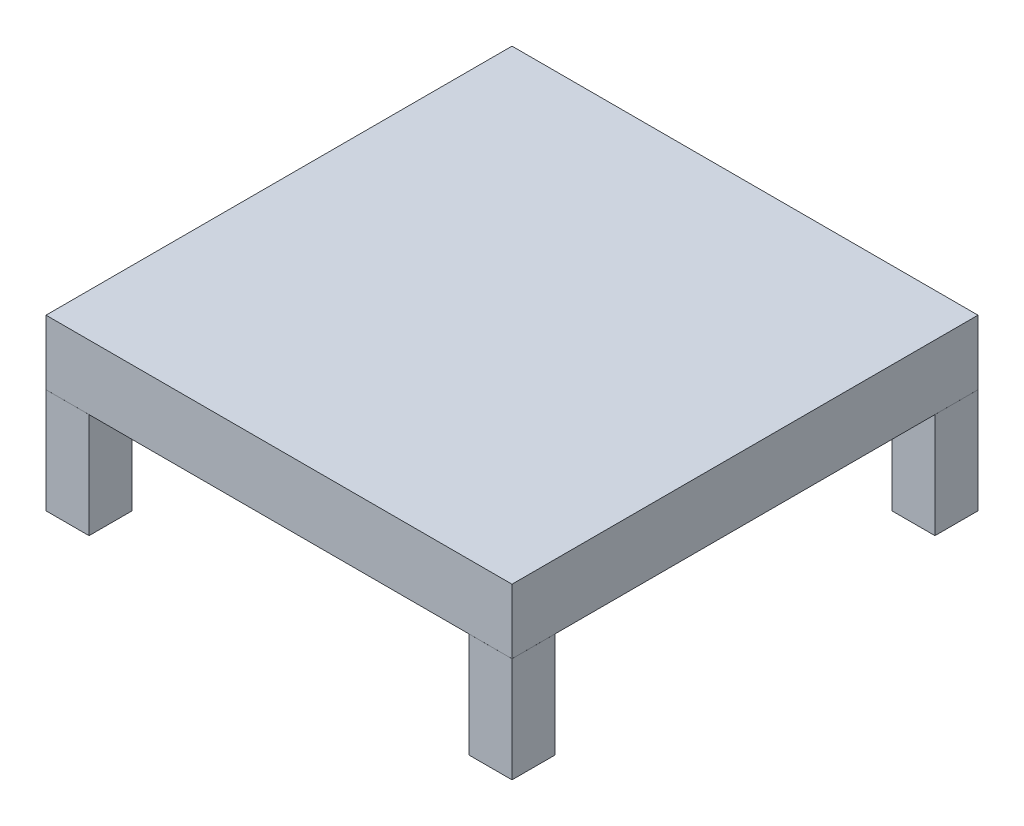
ISO-10303-21;
HEADER;
FILE_DESCRIPTION(('STEP AP214'),'2;1');
FILE_NAME('part.step','',(''),(''),'','','');
FILE_SCHEMA(('AUTOMOTIVE_DESIGN { 1 0 10303 214 1 1 1 1 }'));
ENDSEC;
DATA;
#1=APPLICATION_CONTEXT('core data for automotive mechanical design processes');
#2=APPLICATION_PROTOCOL_DEFINITION('international standard','automotive_design',2000,#1);
#3=PRODUCT_CONTEXT('',#1,'mechanical');
#4=PRODUCT('Part','Part','',(#3));
#5=PRODUCT_RELATED_PRODUCT_CATEGORY('part','',(#4));
#6=PRODUCT_DEFINITION_FORMATION('','',#4);
#7=PRODUCT_DEFINITION_CONTEXT('part definition',#1,'design');
#8=PRODUCT_DEFINITION('design','',#6,#7);
#9=PRODUCT_DEFINITION_SHAPE('','',#8);
#10=(LENGTH_UNIT() NAMED_UNIT(*) SI_UNIT(.MILLI.,.METRE.));
#11=(NAMED_UNIT(*) PLANE_ANGLE_UNIT() SI_UNIT($,.RADIAN.));
#12=(NAMED_UNIT(*) SI_UNIT($,.STERADIAN.) SOLID_ANGLE_UNIT());
#13=UNCERTAINTY_MEASURE_WITH_UNIT(LENGTH_MEASURE(1.E-05),#10,'distance_accuracy_value','');
#14=(GEOMETRIC_REPRESENTATION_CONTEXT(3) GLOBAL_UNCERTAINTY_ASSIGNED_CONTEXT((#13)) GLOBAL_UNIT_ASSIGNED_CONTEXT((#10,
#11,#12)) REPRESENTATION_CONTEXT('',''));
#15=CARTESIAN_POINT('',(0.,0.,0.));
#16=DIRECTION('',(0.,0.,1.));
#17=DIRECTION('',(1.,0.,0.));
#18=AXIS2_PLACEMENT_3D('',#15,#16,#17);
#19=CARTESIAN_POINT('',(-275.,38.1,-275.));
#20=DIRECTION('',(1.,0.,0.));
#21=DIRECTION('',(0.,0.,-1.));
#22=AXIS2_PLACEMENT_3D('',#19,#20,#21);
#23=PLANE('',#22);
#24=DIRECTION('',(0.,-1.,0.));
#25=VECTOR('',#24,1.);
#26=CARTESIAN_POINT('',(-275.,38.1,-275.));
#27=LINE('',#26,#25);
#28=CARTESIAN_POINT('',(-275.,38.1,-275.));
#29=VERTEX_POINT('',#28);
#30=CARTESIAN_POINT('',(-275.,-38.1,-275.));
#31=VERTEX_POINT('',#30);
#32=EDGE_CURVE('E111',#29,#31,#27,.T.);
#33=ORIENTED_EDGE('',*,*,#32,.T.);
#34=DIRECTION('',(0.,0.,1.));
#35=VECTOR('',#34,1.);
#36=CARTESIAN_POINT('',(-275.,-38.1,295.148496587345));
#37=LINE('',#36,#35);
#38=CARTESIAN_POINT('',(-275.,-38.1,275.));
#39=VERTEX_POINT('',#38);
#40=EDGE_CURVE('E86',#31,#39,#37,.T.);
#41=ORIENTED_EDGE('',*,*,#40,.T.);
#42=DIRECTION('',(0.,-1.,0.));
#43=VECTOR('',#42,1.);
#44=CARTESIAN_POINT('',(-275.,38.1,275.));
#45=LINE('',#44,#43);
#46=CARTESIAN_POINT('',(-275.,38.1,275.));
#47=VERTEX_POINT('',#46);
#48=EDGE_CURVE('E57',#47,#39,#45,.T.);
#49=ORIENTED_EDGE('',*,*,#48,.F.);
#50=DIRECTION('',(0.,0.,1.));
#51=VECTOR('',#50,1.);
#52=CARTESIAN_POINT('',(-275.,38.1,-275.));
#53=LINE('',#52,#51);
#54=EDGE_CURVE('E104',#29,#47,#53,.T.);
#55=ORIENTED_EDGE('',*,*,#54,.F.);
#56=EDGE_LOOP('',(#33,#41,#49,#55));
#57=FACE_BOUND('',#56,.T.);
#58=ADVANCED_FACE('F54',(#57),#23,.F.);
#59=CARTESIAN_POINT('',(-275.,38.1,275.));
#60=DIRECTION('',(0.,0.,-1.));
#61=DIRECTION('',(-1.,0.,0.));
#62=AXIS2_PLACEMENT_3D('',#59,#60,#61);
#63=PLANE('',#62);
#64=ORIENTED_EDGE('',*,*,#48,.T.);
#65=DIRECTION('',(1.,0.,0.));
#66=VECTOR('',#65,1.);
#67=CARTESIAN_POINT('',(-275.,-38.1,275.));
#68=LINE('',#67,#66);
#69=CARTESIAN_POINT('',(275.,-38.1,275.));
#70=VERTEX_POINT('',#69);
#71=EDGE_CURVE('E72',#39,#70,#68,.T.);
#72=ORIENTED_EDGE('',*,*,#71,.T.);
#73=DIRECTION('',(0.,-1.,0.));
#74=VECTOR('',#73,1.);
#75=CARTESIAN_POINT('',(275.,38.1,275.));
#76=LINE('',#75,#74);
#77=CARTESIAN_POINT('',(275.,38.1,275.));
#78=VERTEX_POINT('',#77);
#79=EDGE_CURVE('E102',#78,#70,#76,.T.);
#80=ORIENTED_EDGE('',*,*,#79,.F.);
#81=DIRECTION('',(1.,0.,0.));
#82=VECTOR('',#81,1.);
#83=CARTESIAN_POINT('',(-275.,38.1,275.));
#84=LINE('',#83,#82);
#85=EDGE_CURVE('E99',#47,#78,#84,.T.);
#86=ORIENTED_EDGE('',*,*,#85,.F.);
#87=EDGE_LOOP('',(#64,#72,#80,#86));
#88=FACE_BOUND('',#87,.T.);
#89=ADVANCED_FACE('F100',(#88),#63,.F.);
#90=CARTESIAN_POINT('',(275.,38.1,-275.));
#91=DIRECTION('',(-1.,0.,0.));
#92=DIRECTION('',(0.,0.,1.));
#93=AXIS2_PLACEMENT_3D('',#90,#91,#92);
#94=PLANE('',#93);
#95=ORIENTED_EDGE('',*,*,#79,.T.);
#96=DIRECTION('',(0.,0.,-1.));
#97=VECTOR('',#96,1.);
#98=CARTESIAN_POINT('',(275.,-38.1,-275.));
#99=LINE('',#98,#97);
#100=CARTESIAN_POINT('',(275.,-38.1,-275.));
#101=VERTEX_POINT('',#100);
#102=EDGE_CURVE('E117',#70,#101,#99,.T.);
#103=ORIENTED_EDGE('',*,*,#102,.T.);
#104=DIRECTION('',(0.,-1.,0.));
#105=VECTOR('',#104,1.);
#106=CARTESIAN_POINT('',(275.,38.1,-275.));
#107=LINE('',#106,#105);
#108=CARTESIAN_POINT('',(275.,38.1,-275.));
#109=VERTEX_POINT('',#108);
#110=EDGE_CURVE('E118',#109,#101,#107,.T.);
#111=ORIENTED_EDGE('',*,*,#110,.F.);
#112=DIRECTION('',(0.,0.,-1.));
#113=VECTOR('',#112,1.);
#114=CARTESIAN_POINT('',(275.,38.1,-275.));
#115=LINE('',#114,#113);
#116=EDGE_CURVE('E63',#78,#109,#115,.T.);
#117=ORIENTED_EDGE('',*,*,#116,.F.);
#118=EDGE_LOOP('',(#95,#103,#111,#117));
#119=FACE_BOUND('',#118,.T.);
#120=ADVANCED_FACE('F156',(#119),#94,.F.);
#121=CARTESIAN_POINT('',(-275.,38.1,-275.));
#122=DIRECTION('',(0.,0.,1.));
#123=DIRECTION('',(1.,0.,0.));
#124=AXIS2_PLACEMENT_3D('',#121,#122,#123);
#125=PLANE('',#124);
#126=ORIENTED_EDGE('',*,*,#110,.T.);
#127=DIRECTION('',(-1.,0.,0.));
#128=VECTOR('',#127,1.);
#129=CARTESIAN_POINT('',(-275.,-38.1,-275.));
#130=LINE('',#129,#128);
#131=EDGE_CURVE('E108',#101,#31,#130,.T.);
#132=ORIENTED_EDGE('',*,*,#131,.T.);
#133=ORIENTED_EDGE('',*,*,#32,.F.);
#134=DIRECTION('',(-1.,0.,0.));
#135=VECTOR('',#134,1.);
#136=CARTESIAN_POINT('',(-275.,38.1,-275.));
#137=LINE('',#136,#135);
#138=EDGE_CURVE('E14',#109,#29,#137,.T.);
#139=ORIENTED_EDGE('',*,*,#138,.F.);
#140=EDGE_LOOP('',(#126,#132,#133,#139));
#141=FACE_BOUND('',#140,.T.);
#142=ADVANCED_FACE('F151',(#141),#125,.F.);
#143=CARTESIAN_POINT('',(0.,-38.1,0.));
#144=DIRECTION('',(0.,1.,0.));
#145=DIRECTION('',(0.,0.,1.));
#146=AXIS2_PLACEMENT_3D('',#143,#144,#145);
#147=PLANE('',#146);
#148=CARTESIAN_POINT('',(161.147032428209,-38.1,142.922948735837));
#149=DIRECTION('',(0.,-1.,0.));
#150=DIRECTION('',(0.,0.,-1.));
#151=AXIS2_PLACEMENT_3D('',#148,#149,#150);
#152=CIRCLE('',#151,1.99599107484593);
#153=CARTESIAN_POINT('',(161.147032428209,-38.1,140.926957660991));
#154=VERTEX_POINT('',#153);
#155=EDGE_CURVE('E133',#154,#154,#152,.T.);
#156=ORIENTED_EDGE('',*,*,#155,.F.);
#157=EDGE_LOOP('',(#156));
#158=FACE_BOUND('',#157,.T.);
#159=CARTESIAN_POINT('',(75.2717384867525,-38.1,-43.7903374002033));
#160=DIRECTION('',(0.,-1.,0.));
#161=DIRECTION('',(0.,0.,-1.));
#162=AXIS2_PLACEMENT_3D('',#159,#160,#161);
#163=CIRCLE('',#162,1.99600002824873);
#164=CARTESIAN_POINT('',(75.2717384867525,-38.1,-45.7863374284521));
#165=VERTEX_POINT('',#164);
#166=EDGE_CURVE('E127',#165,#165,#163,.T.);
#167=ORIENTED_EDGE('',*,*,#166,.F.);
#168=EDGE_LOOP('',(#167));
#169=FACE_BOUND('',#168,.T.);
#170=ORIENTED_EDGE('',*,*,#131,.F.);
#171=ORIENTED_EDGE('',*,*,#102,.F.);
#172=ORIENTED_EDGE('',*,*,#71,.F.);
#173=ORIENTED_EDGE('',*,*,#40,.F.);
#174=EDGE_LOOP('',(#170,#171,#172,#173));
#175=FACE_BOUND('',#174,.T.);
#176=ADVANCED_FACE('F148',(#158,#169,#175),#147,.F.);
#177=CARTESIAN_POINT('',(0.,38.1,0.));
#178=DIRECTION('',(0.,1.,0.));
#179=DIRECTION('',(0.,0.,1.));
#180=AXIS2_PLACEMENT_3D('',#177,#178,#179);
#181=PLANE('',#180);
#182=ORIENTED_EDGE('',*,*,#54,.T.);
#183=ORIENTED_EDGE('',*,*,#85,.T.);
#184=ORIENTED_EDGE('',*,*,#116,.T.);
#185=ORIENTED_EDGE('',*,*,#138,.T.);
#186=EDGE_LOOP('',(#182,#183,#184,#185));
#187=FACE_BOUND('',#186,.T.);
#188=ADVANCED_FACE('F107',(#187),#181,.T.);
#189=CARTESIAN_POINT('',(75.2717384867525,-35.6235,-43.7903374002033));
#190=DIRECTION('',(0.,-1.,0.));
#191=DIRECTION('',(0.,0.,-1.));
#192=AXIS2_PLACEMENT_3D('',#189,#190,#191);
#193=CYLINDRICAL_SURFACE('',#192,1.99600002824873);
#194=CARTESIAN_POINT('',(75.2717384867525,-35.6235,-43.7903374002033));
#195=DIRECTION('',(0.,-1.,0.));
#196=DIRECTION('',(0.,0.,-1.));
#197=AXIS2_PLACEMENT_3D('',#194,#195,#196);
#198=CIRCLE('',#197,1.99600002824873);
#199=CARTESIAN_POINT('',(75.2717384867525,-35.6235,-45.7863374284521));
#200=VERTEX_POINT('',#199);
#201=EDGE_CURVE('E130',#200,#200,#198,.T.);
#202=ORIENTED_EDGE('',*,*,#201,.F.);
#203=EDGE_LOOP('',(#202));
#204=FACE_BOUND('',#203,.T.);
#205=ORIENTED_EDGE('',*,*,#166,.T.);
#206=EDGE_LOOP('',(#205));
#207=FACE_BOUND('',#206,.T.);
#208=ADVANCED_FACE('F189',(#204,#207),#193,.F.);
#209=CARTESIAN_POINT('',(75.2717384867525,-35.6235,-43.7903374002033));
#210=DIRECTION('',(0.,-1.,0.));
#211=DIRECTION('',(0.,0.,-1.));
#212=AXIS2_PLACEMENT_3D('',#209,#210,#211);
#213=PLANE('',#212);
#214=ORIENTED_EDGE('',*,*,#201,.T.);
#215=EDGE_LOOP('',(#214));
#216=FACE_BOUND('',#215,.T.);
#217=ADVANCED_FACE('F144',(#216),#213,.T.);
#218=CARTESIAN_POINT('',(161.147032428209,-35.6235,142.922948735837));
#219=DIRECTION('',(0.,-1.,0.));
#220=DIRECTION('',(0.,0.,-1.));
#221=AXIS2_PLACEMENT_3D('',#218,#219,#220);
#222=CYLINDRICAL_SURFACE('',#221,1.99599107484593);
#223=CARTESIAN_POINT('',(161.147032428209,-35.6235,142.922948735837));
#224=DIRECTION('',(0.,-1.,0.));
#225=DIRECTION('',(0.,0.,-1.));
#226=AXIS2_PLACEMENT_3D('',#223,#224,#225);
#227=CIRCLE('',#226,1.99599107484593);
#228=CARTESIAN_POINT('',(161.147032428209,-35.6235,140.926957660991));
#229=VERTEX_POINT('',#228);
#230=EDGE_CURVE('E113',#229,#229,#227,.T.);
#231=ORIENTED_EDGE('',*,*,#230,.F.);
#232=EDGE_LOOP('',(#231));
#233=FACE_BOUND('',#232,.T.);
#234=ORIENTED_EDGE('',*,*,#155,.T.);
#235=EDGE_LOOP('',(#234));
#236=FACE_BOUND('',#235,.T.);
#237=ADVANCED_FACE('F141',(#233,#236),#222,.F.);
#238=CARTESIAN_POINT('',(161.147032428209,-35.6235,142.922948735837));
#239=DIRECTION('',(0.,-1.,0.));
#240=DIRECTION('',(0.,0.,-1.));
#241=AXIS2_PLACEMENT_3D('',#238,#239,#240);
#242=PLANE('',#241);
#243=ORIENTED_EDGE('',*,*,#230,.T.);
#244=EDGE_LOOP('',(#243));
#245=FACE_BOUND('',#244,.T.);
#246=ADVANCED_FACE('F139',(#245),#242,.T.);
#247=CLOSED_SHELL('',(#58,#89,#120,#142,#176,#188,#208,#217,#237,#246));
#248=MANIFOLD_SOLID_BREP('B2',#247);
#249=CARTESIAN_POINT('',(-275.,-933.742048968553,224.2));
#250=DIRECTION('',(0.,0.,1.));
#251=DIRECTION('',(1.,0.,0.));
#252=AXIS2_PLACEMENT_3D('',#249,#250,#251);
#253=PLANE('',#252);
#254=DIRECTION('',(0.,1.,0.));
#255=VECTOR('',#254,1.);
#256=CARTESIAN_POINT('',(-224.2,-933.742048968553,224.2));
#257=LINE('',#256,#255);
#258=CARTESIAN_POINT('',(-224.2,-161.925,224.2));
#259=VERTEX_POINT('',#258);
#260=CARTESIAN_POINT('',(-224.2,-38.1254,224.2));
#261=VERTEX_POINT('',#260);
#262=EDGE_CURVE('E318',#259,#261,#257,.T.);
#263=ORIENTED_EDGE('',*,*,#262,.F.);
#264=DIRECTION('',(-1.,0.,0.));
#265=VECTOR('',#264,1.);
#266=CARTESIAN_POINT('',(-275.,-161.925,224.2));
#267=LINE('',#266,#265);
#268=CARTESIAN_POINT('',(-275.,-161.925,224.2));
#269=VERTEX_POINT('',#268);
#270=EDGE_CURVE('E322',#259,#269,#267,.T.);
#271=ORIENTED_EDGE('',*,*,#270,.T.);
#272=DIRECTION('',(0.,1.,0.));
#273=VECTOR('',#272,1.);
#274=CARTESIAN_POINT('',(-275.,-933.742048968553,224.2));
#275=LINE('',#274,#273);
#276=CARTESIAN_POINT('',(-275.,-38.1254,224.2));
#277=VERTEX_POINT('',#276);
#278=EDGE_CURVE('E310',#269,#277,#275,.T.);
#279=ORIENTED_EDGE('',*,*,#278,.T.);
#280=DIRECTION('',(1.,0.,0.));
#281=VECTOR('',#280,1.);
#282=CARTESIAN_POINT('',(-275.,-38.1254,224.2));
#283=LINE('',#282,#281);
#284=EDGE_CURVE('E342',#277,#261,#283,.T.);
#285=ORIENTED_EDGE('',*,*,#284,.T.);
#286=EDGE_LOOP('',(#263,#271,#279,#285));
#287=FACE_BOUND('',#286,.T.);
#288=ADVANCED_FACE('F274',(#287),#253,.F.);
#289=CARTESIAN_POINT('',(-224.2,-933.742048968553,275.));
#290=DIRECTION('',(-1.,0.,0.));
#291=DIRECTION('',(0.,0.,1.));
#292=AXIS2_PLACEMENT_3D('',#289,#290,#291);
#293=PLANE('',#292);
#294=DIRECTION('',(0.,1.,0.));
#295=VECTOR('',#294,1.);
#296=CARTESIAN_POINT('',(-224.2,-933.742048968553,275.));
#297=LINE('',#296,#295);
#298=CARTESIAN_POINT('',(-224.2,-161.925,275.));
#299=VERTEX_POINT('',#298);
#300=CARTESIAN_POINT('',(-224.2,-38.1254,275.));
#301=VERTEX_POINT('',#300);
#302=EDGE_CURVE('E297',#299,#301,#297,.T.);
#303=ORIENTED_EDGE('',*,*,#302,.F.);
#304=DIRECTION('',(0.,0.,-1.));
#305=VECTOR('',#304,1.);
#306=CARTESIAN_POINT('',(-224.2,-161.925,275.));
#307=LINE('',#306,#305);
#308=EDGE_CURVE('E326',#299,#259,#307,.T.);
#309=ORIENTED_EDGE('',*,*,#308,.T.);
#310=ORIENTED_EDGE('',*,*,#262,.T.);
#311=DIRECTION('',(0.,0.,1.));
#312=VECTOR('',#311,1.);
#313=CARTESIAN_POINT('',(-224.2,-38.1254,275.));
#314=LINE('',#313,#312);
#315=EDGE_CURVE('E335',#261,#301,#314,.T.);
#316=ORIENTED_EDGE('',*,*,#315,.T.);
#317=EDGE_LOOP('',(#303,#309,#310,#316));
#318=FACE_BOUND('',#317,.T.);
#319=ADVANCED_FACE('F334',(#318),#293,.F.);
#320=CARTESIAN_POINT('',(-275.,38.1,275.));
#321=DIRECTION('',(0.,0.,-1.));
#322=DIRECTION('',(-1.,0.,0.));
#323=AXIS2_PLACEMENT_3D('',#320,#321,#322);
#324=PLANE('',#323);
#325=DIRECTION('',(0.,-1.,0.));
#326=VECTOR('',#325,1.);
#327=CARTESIAN_POINT('',(-275.,38.1,275.));
#328=LINE('',#327,#326);
#329=CARTESIAN_POINT('',(-275.,-38.1254,275.));
#330=VERTEX_POINT('',#329);
#331=CARTESIAN_POINT('',(-275.,-161.925,275.));
#332=VERTEX_POINT('',#331);
#333=EDGE_CURVE('E278',#330,#332,#328,.T.);
#334=ORIENTED_EDGE('',*,*,#333,.T.);
#335=DIRECTION('',(-1.,0.,0.));
#336=VECTOR('',#335,1.);
#337=CARTESIAN_POINT('',(275.,-161.925,275.));
#338=LINE('',#337,#336);
#339=EDGE_CURVE('E289',#299,#332,#338,.T.);
#340=ORIENTED_EDGE('',*,*,#339,.F.);
#341=ORIENTED_EDGE('',*,*,#302,.T.);
#342=DIRECTION('',(-1.,0.,0.));
#343=VECTOR('',#342,1.);
#344=CARTESIAN_POINT('',(-275.,-38.1254,275.));
#345=LINE('',#344,#343);
#346=EDGE_CURVE('E336',#301,#330,#345,.T.);
#347=ORIENTED_EDGE('',*,*,#346,.T.);
#348=EDGE_LOOP('',(#334,#340,#341,#347));
#349=FACE_BOUND('',#348,.T.);
#350=ADVANCED_FACE('F331',(#349),#324,.F.);
#351=CARTESIAN_POINT('',(-275.,38.1,-275.));
#352=DIRECTION('',(1.,0.,0.));
#353=DIRECTION('',(0.,0.,-1.));
#354=AXIS2_PLACEMENT_3D('',#351,#352,#353);
#355=PLANE('',#354);
#356=ORIENTED_EDGE('',*,*,#278,.F.);
#357=DIRECTION('',(0.,0.,-1.));
#358=VECTOR('',#357,1.);
#359=CARTESIAN_POINT('',(-275.,-161.925,-275.));
#360=LINE('',#359,#358);
#361=EDGE_CURVE('E328',#332,#269,#360,.T.);
#362=ORIENTED_EDGE('',*,*,#361,.F.);
#363=ORIENTED_EDGE('',*,*,#333,.F.);
#364=DIRECTION('',(0.,0.,-1.));
#365=VECTOR('',#364,1.);
#366=CARTESIAN_POINT('',(-275.,-38.1254,295.148496587345));
#367=LINE('',#366,#365);
#368=EDGE_CURVE('E52',#330,#277,#367,.T.);
#369=ORIENTED_EDGE('',*,*,#368,.T.);
#370=EDGE_LOOP('',(#356,#362,#363,#369));
#371=FACE_BOUND('',#370,.T.);
#372=ADVANCED_FACE('F276',(#371),#355,.F.);
#373=CARTESIAN_POINT('',(-275.,-38.1254,295.148496587345));
#374=DIRECTION('',(0.,-1.,0.));
#375=DIRECTION('',(0.,0.,-1.));
#376=AXIS2_PLACEMENT_3D('',#373,#374,#375);
#377=PLANE('',#376);
#378=ORIENTED_EDGE('',*,*,#315,.F.);
#379=ORIENTED_EDGE('',*,*,#284,.F.);
#380=ORIENTED_EDGE('',*,*,#368,.F.);
#381=ORIENTED_EDGE('',*,*,#346,.F.);
#382=EDGE_LOOP('',(#378,#379,#380,#381));
#383=FACE_BOUND('',#382,.T.);
#384=ADVANCED_FACE('F348',(#383),#377,.F.);
#385=CARTESIAN_POINT('',(0.,-161.925,0.));
#386=DIRECTION('',(0.,1.,0.));
#387=DIRECTION('',(0.,0.,1.));
#388=AXIS2_PLACEMENT_3D('',#385,#386,#387);
#389=PLANE('',#388);
#390=ORIENTED_EDGE('',*,*,#308,.F.);
#391=ORIENTED_EDGE('',*,*,#339,.T.);
#392=ORIENTED_EDGE('',*,*,#361,.T.);
#393=ORIENTED_EDGE('',*,*,#270,.F.);
#394=EDGE_LOOP('',(#390,#391,#392,#393));
#395=FACE_BOUND('',#394,.T.);
#396=ADVANCED_FACE('F327',(#395),#389,.F.);
#397=CLOSED_SHELL('',(#288,#319,#350,#372,#384,#396));
#398=MANIFOLD_SOLID_BREP('B8',#397);
#399=CARTESIAN_POINT('',(-224.2,-933.742048968553,-275.));
#400=DIRECTION('',(-1.,0.,0.));
#401=DIRECTION('',(0.,0.,1.));
#402=AXIS2_PLACEMENT_3D('',#399,#400,#401);
#403=PLANE('',#402);
#404=DIRECTION('',(0.,1.,0.));
#405=VECTOR('',#404,1.);
#406=CARTESIAN_POINT('',(-224.2,-933.742048968553,-224.2));
#407=LINE('',#406,#405);
#408=CARTESIAN_POINT('',(-224.2,-161.925,-224.2));
#409=VERTEX_POINT('',#408);
#410=CARTESIAN_POINT('',(-224.2,-38.1254,-224.2));
#411=VERTEX_POINT('',#410);
#412=EDGE_CURVE('E482',#409,#411,#407,.T.);
#413=ORIENTED_EDGE('',*,*,#412,.F.);
#414=DIRECTION('',(0.,0.,-1.));
#415=VECTOR('',#414,1.);
#416=CARTESIAN_POINT('',(-224.2,-161.925,-275.));
#417=LINE('',#416,#415);
#418=CARTESIAN_POINT('',(-224.2,-161.925,-275.));
#419=VERTEX_POINT('',#418);
#420=EDGE_CURVE('E459',#409,#419,#417,.T.);
#421=ORIENTED_EDGE('',*,*,#420,.T.);
#422=DIRECTION('',(0.,1.,0.));
#423=VECTOR('',#422,1.);
#424=CARTESIAN_POINT('',(-224.2,-933.742048968553,-275.));
#425=LINE('',#424,#423);
#426=CARTESIAN_POINT('',(-224.2,-38.1254,-275.));
#427=VERTEX_POINT('',#426);
#428=EDGE_CURVE('E471',#419,#427,#425,.T.);
#429=ORIENTED_EDGE('',*,*,#428,.T.);
#430=DIRECTION('',(0.,0.,1.));
#431=VECTOR('',#430,1.);
#432=CARTESIAN_POINT('',(-224.2,-38.1254,-275.));
#433=LINE('',#432,#431);
#434=EDGE_CURVE('E479',#427,#411,#433,.T.);
#435=ORIENTED_EDGE('',*,*,#434,.T.);
#436=EDGE_LOOP('',(#413,#421,#429,#435));
#437=FACE_BOUND('',#436,.T.);
#438=ADVANCED_FACE('F419',(#437),#403,.F.);
#439=CARTESIAN_POINT('',(-275.,-933.742048968553,-224.2));
#440=DIRECTION('',(0.,0.,-1.));
#441=DIRECTION('',(-1.,0.,0.));
#442=AXIS2_PLACEMENT_3D('',#439,#440,#441);
#443=PLANE('',#442);
#444=DIRECTION('',(0.,1.,0.));
#445=VECTOR('',#444,1.);
#446=CARTESIAN_POINT('',(-275.,-933.742048968553,-224.2));
#447=LINE('',#446,#445);
#448=CARTESIAN_POINT('',(-275.,-161.925,-224.2));
#449=VERTEX_POINT('',#448);
#450=CARTESIAN_POINT('',(-275.,-38.1254,-224.2));
#451=VERTEX_POINT('',#450);
#452=EDGE_CURVE('E453',#449,#451,#447,.T.);
#453=ORIENTED_EDGE('',*,*,#452,.F.);
#454=DIRECTION('',(1.,0.,0.));
#455=VECTOR('',#454,1.);
#456=CARTESIAN_POINT('',(-275.,-161.925,-224.2));
#457=LINE('',#456,#455);
#458=EDGE_CURVE('E434',#449,#409,#457,.T.);
#459=ORIENTED_EDGE('',*,*,#458,.T.);
#460=ORIENTED_EDGE('',*,*,#412,.T.);
#461=DIRECTION('',(-1.,0.,0.));
#462=VECTOR('',#461,1.);
#463=CARTESIAN_POINT('',(-275.,-38.1254,-224.2));
#464=LINE('',#463,#462);
#465=EDGE_CURVE('E477',#411,#451,#464,.T.);
#466=ORIENTED_EDGE('',*,*,#465,.T.);
#467=EDGE_LOOP('',(#453,#459,#460,#466));
#468=FACE_BOUND('',#467,.T.);
#469=ADVANCED_FACE('F491',(#468),#443,.F.);
#470=CARTESIAN_POINT('',(-275.,38.1,-275.));
#471=DIRECTION('',(0.,0.,1.));
#472=DIRECTION('',(1.,0.,0.));
#473=AXIS2_PLACEMENT_3D('',#470,#471,#472);
#474=PLANE('',#473);
#475=ORIENTED_EDGE('',*,*,#428,.F.);
#476=DIRECTION('',(1.,0.,0.));
#477=VECTOR('',#476,1.);
#478=CARTESIAN_POINT('',(275.,-161.925,-275.));
#479=LINE('',#478,#477);
#480=CARTESIAN_POINT('',(-275.,-161.925,-275.));
#481=VERTEX_POINT('',#480);
#482=EDGE_CURVE('E465',#481,#419,#479,.T.);
#483=ORIENTED_EDGE('',*,*,#482,.F.);
#484=DIRECTION('',(0.,-1.,0.));
#485=VECTOR('',#484,1.);
#486=CARTESIAN_POINT('',(-275.,38.1,-275.));
#487=LINE('',#486,#485);
#488=CARTESIAN_POINT('',(-275.,-38.1254,-275.));
#489=VERTEX_POINT('',#488);
#490=EDGE_CURVE('E427',#489,#481,#487,.T.);
#491=ORIENTED_EDGE('',*,*,#490,.F.);
#492=DIRECTION('',(1.,0.,0.));
#493=VECTOR('',#492,1.);
#494=CARTESIAN_POINT('',(-275.,-38.1254,-275.));
#495=LINE('',#494,#493);
#496=EDGE_CURVE('E442',#489,#427,#495,.T.);
#497=ORIENTED_EDGE('',*,*,#496,.T.);
#498=EDGE_LOOP('',(#475,#483,#491,#497));
#499=FACE_BOUND('',#498,.T.);
#500=ADVANCED_FACE('F470',(#499),#474,.F.);
#501=CARTESIAN_POINT('',(-275.,38.1,-275.));
#502=DIRECTION('',(1.,0.,0.));
#503=DIRECTION('',(0.,0.,-1.));
#504=AXIS2_PLACEMENT_3D('',#501,#502,#503);
#505=PLANE('',#504);
#506=ORIENTED_EDGE('',*,*,#490,.T.);
#507=DIRECTION('',(0.,0.,1.));
#508=VECTOR('',#507,1.);
#509=CARTESIAN_POINT('',(-275.,-161.925,-275.));
#510=LINE('',#509,#508);
#511=EDGE_CURVE('E272',#481,#449,#510,.T.);
#512=ORIENTED_EDGE('',*,*,#511,.T.);
#513=ORIENTED_EDGE('',*,*,#452,.T.);
#514=DIRECTION('',(0.,0.,-1.));
#515=VECTOR('',#514,1.);
#516=CARTESIAN_POINT('',(-275.,-38.1254,295.148496587345));
#517=LINE('',#516,#515);
#518=EDGE_CURVE('E474',#451,#489,#517,.T.);
#519=ORIENTED_EDGE('',*,*,#518,.T.);
#520=EDGE_LOOP('',(#506,#512,#513,#519));
#521=FACE_BOUND('',#520,.T.);
#522=ADVANCED_FACE('F473',(#521),#505,.F.);
#523=CARTESIAN_POINT('',(-275.,-38.1254,295.148496587345));
#524=DIRECTION('',(0.,-1.,0.));
#525=DIRECTION('',(0.,0.,-1.));
#526=AXIS2_PLACEMENT_3D('',#523,#524,#525);
#527=PLANE('',#526);
#528=ORIENTED_EDGE('',*,*,#518,.F.);
#529=ORIENTED_EDGE('',*,*,#465,.F.);
#530=ORIENTED_EDGE('',*,*,#434,.F.);
#531=ORIENTED_EDGE('',*,*,#496,.F.);
#532=EDGE_LOOP('',(#528,#529,#530,#531));
#533=FACE_BOUND('',#532,.T.);
#534=ADVANCED_FACE('F421',(#533),#527,.F.);
#535=CARTESIAN_POINT('',(0.,-161.925,0.));
#536=DIRECTION('',(0.,1.,0.));
#537=DIRECTION('',(0.,0.,1.));
#538=AXIS2_PLACEMENT_3D('',#535,#536,#537);
#539=PLANE('',#538);
#540=ORIENTED_EDGE('',*,*,#458,.F.);
#541=ORIENTED_EDGE('',*,*,#511,.F.);
#542=ORIENTED_EDGE('',*,*,#482,.T.);
#543=ORIENTED_EDGE('',*,*,#420,.F.);
#544=EDGE_LOOP('',(#540,#541,#542,#543));
#545=FACE_BOUND('',#544,.T.);
#546=ADVANCED_FACE('F464',(#545),#539,.F.);
#547=CLOSED_SHELL('',(#438,#469,#500,#522,#534,#546));
#548=MANIFOLD_SOLID_BREP('B46',#547);
#549=CARTESIAN_POINT('',(275.,-933.742048968553,-224.2));
#550=DIRECTION('',(0.,0.,-1.));
#551=DIRECTION('',(-1.,0.,0.));
#552=AXIS2_PLACEMENT_3D('',#549,#550,#551);
#553=PLANE('',#552);
#554=DIRECTION('',(0.,1.,0.));
#555=VECTOR('',#554,1.);
#556=CARTESIAN_POINT('',(224.2,-933.742048968553,-224.2));
#557=LINE('',#556,#555);
#558=CARTESIAN_POINT('',(224.2,-161.925,-224.2));
#559=VERTEX_POINT('',#558);
#560=CARTESIAN_POINT('',(224.2,-38.1254,-224.2));
#561=VERTEX_POINT('',#560);
#562=EDGE_CURVE('E625',#559,#561,#557,.T.);
#563=ORIENTED_EDGE('',*,*,#562,.F.);
#564=DIRECTION('',(1.,0.,0.));
#565=VECTOR('',#564,1.);
#566=CARTESIAN_POINT('',(275.,-161.925,-224.2));
#567=LINE('',#566,#565);
#568=CARTESIAN_POINT('',(275.,-161.925,-224.2));
#569=VERTEX_POINT('',#568);
#570=EDGE_CURVE('E605',#559,#569,#567,.T.);
#571=ORIENTED_EDGE('',*,*,#570,.T.);
#572=DIRECTION('',(0.,1.,0.));
#573=VECTOR('',#572,1.);
#574=CARTESIAN_POINT('',(275.,-933.742048968553,-224.2));
#575=LINE('',#574,#573);
#576=CARTESIAN_POINT('',(275.,-38.1254,-224.2));
#577=VERTEX_POINT('',#576);
#578=EDGE_CURVE('E632',#569,#577,#575,.T.);
#579=ORIENTED_EDGE('',*,*,#578,.T.);
#580=DIRECTION('',(-1.,0.,0.));
#581=VECTOR('',#580,1.);
#582=CARTESIAN_POINT('',(275.,-38.1254,-224.2));
#583=LINE('',#582,#581);
#584=EDGE_CURVE('E630',#577,#561,#583,.T.);
#585=ORIENTED_EDGE('',*,*,#584,.T.);
#586=EDGE_LOOP('',(#563,#571,#579,#585));
#587=FACE_BOUND('',#586,.T.);
#588=ADVANCED_FACE('F564',(#587),#553,.F.);
#589=CARTESIAN_POINT('',(224.2,-933.742048968553,-275.));
#590=DIRECTION('',(1.,0.,0.));
#591=DIRECTION('',(0.,0.,-1.));
#592=AXIS2_PLACEMENT_3D('',#589,#590,#591);
#593=PLANE('',#592);
#594=DIRECTION('',(0.,1.,0.));
#595=VECTOR('',#594,1.);
#596=CARTESIAN_POINT('',(224.2,-933.742048968553,-275.));
#597=LINE('',#596,#595);
#598=CARTESIAN_POINT('',(224.2,-161.925,-275.));
#599=VERTEX_POINT('',#598);
#600=CARTESIAN_POINT('',(224.2,-38.1254,-275.));
#601=VERTEX_POINT('',#600);
#602=EDGE_CURVE('E600',#599,#601,#597,.T.);
#603=ORIENTED_EDGE('',*,*,#602,.F.);
#604=DIRECTION('',(0.,0.,1.));
#605=VECTOR('',#604,1.);
#606=CARTESIAN_POINT('',(224.2,-161.925,-275.));
#607=LINE('',#606,#605);
#608=EDGE_CURVE('E610',#599,#559,#607,.T.);
#609=ORIENTED_EDGE('',*,*,#608,.T.);
#610=ORIENTED_EDGE('',*,*,#562,.T.);
#611=DIRECTION('',(0.,0.,-1.));
#612=VECTOR('',#611,1.);
#613=CARTESIAN_POINT('',(224.2,-38.1254,-275.));
#614=LINE('',#613,#612);
#615=EDGE_CURVE('E623',#561,#601,#614,.T.);
#616=ORIENTED_EDGE('',*,*,#615,.T.);
#617=EDGE_LOOP('',(#603,#609,#610,#616));
#618=FACE_BOUND('',#617,.T.);
#619=ADVANCED_FACE('F621',(#618),#593,.F.);
#620=CARTESIAN_POINT('',(-275.,38.1,-275.));
#621=DIRECTION('',(0.,0.,1.));
#622=DIRECTION('',(1.,0.,0.));
#623=AXIS2_PLACEMENT_3D('',#620,#621,#622);
#624=PLANE('',#623);
#625=DIRECTION('',(0.,-1.,0.));
#626=VECTOR('',#625,1.);
#627=CARTESIAN_POINT('',(275.,38.1,-275.));
#628=LINE('',#627,#626);
#629=CARTESIAN_POINT('',(275.,-38.1254,-275.));
#630=VERTEX_POINT('',#629);
#631=CARTESIAN_POINT('',(275.,-161.925,-275.));
#632=VERTEX_POINT('',#631);
#633=EDGE_CURVE('E573',#630,#632,#628,.T.);
#634=ORIENTED_EDGE('',*,*,#633,.T.);
#635=DIRECTION('',(1.,0.,0.));
#636=VECTOR('',#635,1.);
#637=CARTESIAN_POINT('',(275.,-161.925,-275.));
#638=LINE('',#637,#636);
#639=EDGE_CURVE('E581',#599,#632,#638,.T.);
#640=ORIENTED_EDGE('',*,*,#639,.F.);
#641=ORIENTED_EDGE('',*,*,#602,.T.);
#642=DIRECTION('',(1.,0.,0.));
#643=VECTOR('',#642,1.);
#644=CARTESIAN_POINT('',(-275.,-38.1254,-275.));
#645=LINE('',#644,#643);
#646=EDGE_CURVE('E568',#601,#630,#645,.T.);
#647=ORIENTED_EDGE('',*,*,#646,.T.);
#648=EDGE_LOOP('',(#634,#640,#641,#647));
#649=FACE_BOUND('',#648,.T.);
#650=ADVANCED_FACE('F617',(#649),#624,.F.);
#651=CARTESIAN_POINT('',(275.,38.1,-275.));
#652=DIRECTION('',(-1.,0.,0.));
#653=DIRECTION('',(0.,0.,1.));
#654=AXIS2_PLACEMENT_3D('',#651,#652,#653);
#655=PLANE('',#654);
#656=ORIENTED_EDGE('',*,*,#578,.F.);
#657=DIRECTION('',(0.,0.,1.));
#658=VECTOR('',#657,1.);
#659=CARTESIAN_POINT('',(275.,-161.925,-275.));
#660=LINE('',#659,#658);
#661=EDGE_CURVE('E614',#632,#569,#660,.T.);
#662=ORIENTED_EDGE('',*,*,#661,.F.);
#663=ORIENTED_EDGE('',*,*,#633,.F.);
#664=DIRECTION('',(0.,0.,1.));
#665=VECTOR('',#664,1.);
#666=CARTESIAN_POINT('',(275.,-38.1254,-275.));
#667=LINE('',#666,#665);
#668=EDGE_CURVE('E417',#630,#577,#667,.T.);
#669=ORIENTED_EDGE('',*,*,#668,.T.);
#670=EDGE_LOOP('',(#656,#662,#663,#669));
#671=FACE_BOUND('',#670,.T.);
#672=ADVANCED_FACE('F566',(#671),#655,.F.);
#673=CARTESIAN_POINT('',(-275.,-38.1254,295.148496587345));
#674=DIRECTION('',(0.,-1.,0.));
#675=DIRECTION('',(0.,0.,-1.));
#676=AXIS2_PLACEMENT_3D('',#673,#674,#675);
#677=PLANE('',#676);
#678=ORIENTED_EDGE('',*,*,#646,.F.);
#679=ORIENTED_EDGE('',*,*,#615,.F.);
#680=ORIENTED_EDGE('',*,*,#584,.F.);
#681=ORIENTED_EDGE('',*,*,#668,.F.);
#682=EDGE_LOOP('',(#678,#679,#680,#681));
#683=FACE_BOUND('',#682,.T.);
#684=ADVANCED_FACE('F639',(#683),#677,.F.);
#685=CARTESIAN_POINT('',(0.,-161.925,0.));
#686=DIRECTION('',(0.,1.,0.));
#687=DIRECTION('',(0.,0.,1.));
#688=AXIS2_PLACEMENT_3D('',#685,#686,#687);
#689=PLANE('',#688);
#690=ORIENTED_EDGE('',*,*,#608,.F.);
#691=ORIENTED_EDGE('',*,*,#639,.T.);
#692=ORIENTED_EDGE('',*,*,#661,.T.);
#693=ORIENTED_EDGE('',*,*,#570,.F.);
#694=EDGE_LOOP('',(#690,#691,#692,#693));
#695=FACE_BOUND('',#694,.T.);
#696=ADVANCED_FACE('F611',(#695),#689,.F.);
#697=CLOSED_SHELL('',(#588,#619,#650,#672,#684,#696));
#698=MANIFOLD_SOLID_BREP('B266',#697);
#699=CARTESIAN_POINT('',(224.2,-933.742048968553,275.));
#700=DIRECTION('',(1.,0.,0.));
#701=DIRECTION('',(0.,0.,-1.));
#702=AXIS2_PLACEMENT_3D('',#699,#700,#701);
#703=PLANE('',#702);
#704=DIRECTION('',(0.,1.,0.));
#705=VECTOR('',#704,1.);
#706=CARTESIAN_POINT('',(224.2,-933.742048968553,224.2));
#707=LINE('',#706,#705);
#708=CARTESIAN_POINT('',(224.2,-161.925,224.2));
#709=VERTEX_POINT('',#708);
#710=CARTESIAN_POINT('',(224.2,-38.1254,224.2));
#711=VERTEX_POINT('',#710);
#712=EDGE_CURVE('E723',#709,#711,#707,.T.);
#713=ORIENTED_EDGE('',*,*,#712,.F.);
#714=DIRECTION('',(0.,0.,1.));
#715=VECTOR('',#714,1.);
#716=CARTESIAN_POINT('',(224.2,-161.925,275.));
#717=LINE('',#716,#715);
#718=CARTESIAN_POINT('',(224.2,-161.925,275.));
#719=VERTEX_POINT('',#718);
#720=EDGE_CURVE('E743',#709,#719,#717,.T.);
#721=ORIENTED_EDGE('',*,*,#720,.T.);
#722=DIRECTION('',(0.,1.,0.));
#723=VECTOR('',#722,1.);
#724=CARTESIAN_POINT('',(224.2,-933.742048968553,275.));
#725=LINE('',#724,#723);
#726=CARTESIAN_POINT('',(224.2,-38.1254,275.));
#727=VERTEX_POINT('',#726);
#728=EDGE_CURVE('E708',#719,#727,#725,.T.);
#729=ORIENTED_EDGE('',*,*,#728,.T.);
#730=DIRECTION('',(0.,0.,-1.));
#731=VECTOR('',#730,1.);
#732=CARTESIAN_POINT('',(224.2,-38.1254,275.));
#733=LINE('',#732,#731);
#734=EDGE_CURVE('E768',#727,#711,#733,.T.);
#735=ORIENTED_EDGE('',*,*,#734,.T.);
#736=EDGE_LOOP('',(#713,#721,#729,#735));
#737=FACE_BOUND('',#736,.T.);
#738=ADVANCED_FACE('F700',(#737),#703,.F.);
#739=CARTESIAN_POINT('',(275.,-933.742048968553,224.2));
#740=DIRECTION('',(0.,0.,1.));
#741=DIRECTION('',(1.,0.,0.));
#742=AXIS2_PLACEMENT_3D('',#739,#740,#741);
#743=PLANE('',#742);
#744=DIRECTION('',(0.,1.,0.));
#745=VECTOR('',#744,1.);
#746=CARTESIAN_POINT('',(275.,-933.742048968553,224.2));
#747=LINE('',#746,#745);
#748=CARTESIAN_POINT('',(275.,-161.925,224.2));
#749=VERTEX_POINT('',#748);
#750=CARTESIAN_POINT('',(275.,-38.1254,224.2));
#751=VERTEX_POINT('',#750);
#752=EDGE_CURVE('E749',#749,#751,#747,.T.);
#753=ORIENTED_EDGE('',*,*,#752,.F.);
#754=DIRECTION('',(-1.,0.,0.));
#755=VECTOR('',#754,1.);
#756=CARTESIAN_POINT('',(275.,-161.925,224.2));
#757=LINE('',#756,#755);
#758=EDGE_CURVE('E740',#749,#709,#757,.T.);
#759=ORIENTED_EDGE('',*,*,#758,.T.);
#760=ORIENTED_EDGE('',*,*,#712,.T.);
#761=DIRECTION('',(1.,0.,0.));
#762=VECTOR('',#761,1.);
#763=CARTESIAN_POINT('',(275.,-38.1254,224.2));
#764=LINE('',#763,#762);
#765=EDGE_CURVE('E755',#711,#751,#764,.T.);
#766=ORIENTED_EDGE('',*,*,#765,.T.);
#767=EDGE_LOOP('',(#753,#759,#760,#766));
#768=FACE_BOUND('',#767,.T.);
#769=ADVANCED_FACE('F754',(#768),#743,.F.);
#770=CARTESIAN_POINT('',(275.,38.1,-275.));
#771=DIRECTION('',(-1.,0.,0.));
#772=DIRECTION('',(0.,0.,1.));
#773=AXIS2_PLACEMENT_3D('',#770,#771,#772);
#774=PLANE('',#773);
#775=DIRECTION('',(0.,-1.,0.));
#776=VECTOR('',#775,1.);
#777=CARTESIAN_POINT('',(275.,38.1,275.));
#778=LINE('',#777,#776);
#779=CARTESIAN_POINT('',(275.,-38.1254,275.));
#780=VERTEX_POINT('',#779);
#781=CARTESIAN_POINT('',(275.,-161.925,275.));
#782=VERTEX_POINT('',#781);
#783=EDGE_CURVE('E562',#780,#782,#778,.T.);
#784=ORIENTED_EDGE('',*,*,#783,.T.);
#785=DIRECTION('',(0.,0.,1.));
#786=VECTOR('',#785,1.);
#787=CARTESIAN_POINT('',(275.,-161.925,-275.));
#788=LINE('',#787,#786);
#789=EDGE_CURVE('E715',#749,#782,#788,.T.);
#790=ORIENTED_EDGE('',*,*,#789,.F.);
#791=ORIENTED_EDGE('',*,*,#752,.T.);
#792=DIRECTION('',(0.,0.,1.));
#793=VECTOR('',#792,1.);
#794=CARTESIAN_POINT('',(275.,-38.1254,-275.));
#795=LINE('',#794,#793);
#796=EDGE_CURVE('E760',#751,#780,#795,.T.);
#797=ORIENTED_EDGE('',*,*,#796,.T.);
#798=EDGE_LOOP('',(#784,#790,#791,#797));
#799=FACE_BOUND('',#798,.T.);
#800=ADVANCED_FACE('F747',(#799),#774,.F.);
#801=CARTESIAN_POINT('',(-275.,38.1,275.));
#802=DIRECTION('',(0.,0.,-1.));
#803=DIRECTION('',(-1.,0.,0.));
#804=AXIS2_PLACEMENT_3D('',#801,#802,#803);
#805=PLANE('',#804);
#806=ORIENTED_EDGE('',*,*,#728,.F.);
#807=DIRECTION('',(-1.,0.,0.));
#808=VECTOR('',#807,1.);
#809=CARTESIAN_POINT('',(275.,-161.925,275.));
#810=LINE('',#809,#808);
#811=EDGE_CURVE('E752',#782,#719,#810,.T.);
#812=ORIENTED_EDGE('',*,*,#811,.F.);
#813=ORIENTED_EDGE('',*,*,#783,.F.);
#814=DIRECTION('',(-1.,0.,0.));
#815=VECTOR('',#814,1.);
#816=CARTESIAN_POINT('',(-275.,-38.1254,275.));
#817=LINE('',#816,#815);
#818=EDGE_CURVE('E756',#780,#727,#817,.T.);
#819=ORIENTED_EDGE('',*,*,#818,.T.);
#820=EDGE_LOOP('',(#806,#812,#813,#819));
#821=FACE_BOUND('',#820,.T.);
#822=ADVANCED_FACE('F702',(#821),#805,.F.);
#823=CARTESIAN_POINT('',(-275.,-38.1254,295.148496587345));
#824=DIRECTION('',(0.,-1.,0.));
#825=DIRECTION('',(0.,0.,-1.));
#826=AXIS2_PLACEMENT_3D('',#823,#824,#825);
#827=PLANE('',#826);
#828=ORIENTED_EDGE('',*,*,#796,.F.);
#829=ORIENTED_EDGE('',*,*,#765,.F.);
#830=ORIENTED_EDGE('',*,*,#734,.F.);
#831=ORIENTED_EDGE('',*,*,#818,.F.);
#832=EDGE_LOOP('',(#828,#829,#830,#831));
#833=FACE_BOUND('',#832,.T.);
#834=ADVANCED_FACE('F771',(#833),#827,.F.);
#835=CARTESIAN_POINT('',(0.,-161.925,0.));
#836=DIRECTION('',(0.,1.,0.));
#837=DIRECTION('',(0.,0.,1.));
#838=AXIS2_PLACEMENT_3D('',#835,#836,#837);
#839=PLANE('',#838);
#840=ORIENTED_EDGE('',*,*,#758,.F.);
#841=ORIENTED_EDGE('',*,*,#789,.T.);
#842=ORIENTED_EDGE('',*,*,#811,.T.);
#843=ORIENTED_EDGE('',*,*,#720,.F.);
#844=EDGE_LOOP('',(#840,#841,#842,#843));
#845=FACE_BOUND('',#844,.T.);
#846=ADVANCED_FACE('F741',(#845),#839,.F.);
#847=CLOSED_SHELL('',(#738,#769,#800,#822,#834,#846));
#848=MANIFOLD_SOLID_BREP('B411',#847);
#849=ADVANCED_BREP_SHAPE_REPRESENTATION('',(#18,#248,#398,#548,#698,#848),#14);
#850=SHAPE_DEFINITION_REPRESENTATION(#9,#849);
ENDSEC;
END-ISO-10303-21;
